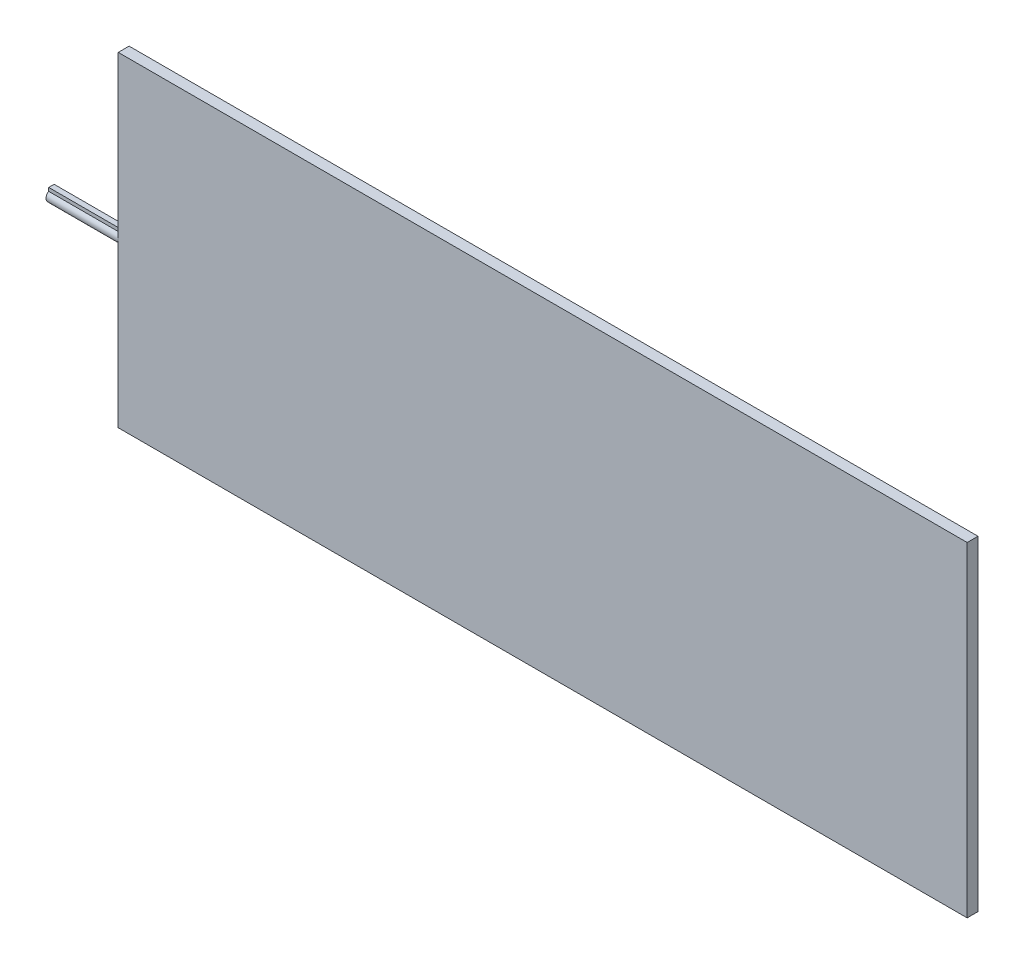
ISO-10303-21;
HEADER;
FILE_DESCRIPTION(('STEP AP214'),'2;1');
FILE_NAME('part.step','',(''),(''),'','','');
FILE_SCHEMA(('AUTOMOTIVE_DESIGN { 1 0 10303 214 1 1 1 1 }'));
ENDSEC;
DATA;
#1=APPLICATION_CONTEXT('core data for automotive mechanical design processes');
#2=APPLICATION_PROTOCOL_DEFINITION('international standard','automotive_design',2000,#1);
#3=PRODUCT_CONTEXT('',#1,'mechanical');
#4=PRODUCT('Part','Part','',(#3));
#5=PRODUCT_RELATED_PRODUCT_CATEGORY('part','',(#4));
#6=PRODUCT_DEFINITION_FORMATION('','',#4);
#7=PRODUCT_DEFINITION_CONTEXT('part definition',#1,'design');
#8=PRODUCT_DEFINITION('design','',#6,#7);
#9=PRODUCT_DEFINITION_SHAPE('','',#8);
#10=(LENGTH_UNIT() NAMED_UNIT(*) SI_UNIT(.MILLI.,.METRE.));
#11=(NAMED_UNIT(*) PLANE_ANGLE_UNIT() SI_UNIT($,.RADIAN.));
#12=(NAMED_UNIT(*) SI_UNIT($,.STERADIAN.) SOLID_ANGLE_UNIT());
#13=UNCERTAINTY_MEASURE_WITH_UNIT(LENGTH_MEASURE(1.E-05),#10,'distance_accuracy_value','');
#14=(GEOMETRIC_REPRESENTATION_CONTEXT(3) GLOBAL_UNCERTAINTY_ASSIGNED_CONTEXT((#13)) GLOBAL_UNIT_ASSIGNED_CONTEXT((#10,
#11,#12)) REPRESENTATION_CONTEXT('',''));
#15=CARTESIAN_POINT('',(0.,0.,0.));
#16=DIRECTION('',(0.,0.,1.));
#17=DIRECTION('',(1.,0.,0.));
#18=AXIS2_PLACEMENT_3D('',#15,#16,#17);
#19=CARTESIAN_POINT('',(-117.5,-45.,3.));
#20=DIRECTION('',(1.,0.,0.));
#21=DIRECTION('',(0.,0.,-1.));
#22=AXIS2_PLACEMENT_3D('',#19,#20,#21);
#23=PLANE('',#22);
#24=CARTESIAN_POINT('',(-117.5,0.,1.5));
#25=DIRECTION('',(-1.,0.,0.));
#26=DIRECTION('',(0.,0.,1.));
#27=AXIS2_PLACEMENT_3D('',#24,#25,#26);
#28=CIRCLE('',#27,1.5);
#29=CARTESIAN_POINT('',(-117.5,1.29903810567667,0.749999999999994));
#30=VERTEX_POINT('',#29);
#31=CARTESIAN_POINT('',(-117.5,0.,0.));
#32=VERTEX_POINT('',#31);
#33=EDGE_CURVE('E51',#30,#32,#28,.T.);
#34=ORIENTED_EDGE('',*,*,#33,.F.);
#35=DIRECTION('',(0.,-1.,0.));
#36=VECTOR('',#35,1.);
#37=CARTESIAN_POINT('',(-117.5,2.25000000000001,0.749999999999994));
#38=LINE('',#37,#36);
#39=CARTESIAN_POINT('',(-117.5,2.25000000000001,0.749999999999994));
#40=VERTEX_POINT('',#39);
#41=EDGE_CURVE('E61',#40,#30,#38,.T.);
#42=ORIENTED_EDGE('',*,*,#41,.F.);
#43=DIRECTION('',(0.,0.,-1.));
#44=VECTOR('',#43,1.);
#45=CARTESIAN_POINT('',(-117.5,2.25000000000001,0.749999999999994));
#46=LINE('',#45,#44);
#47=CARTESIAN_POINT('',(-117.5,2.25000000000001,2.24999999999999));
#48=VERTEX_POINT('',#47);
#49=EDGE_CURVE('E196',#48,#40,#46,.T.);
#50=ORIENTED_EDGE('',*,*,#49,.F.);
#51=DIRECTION('',(0.,1.,0.));
#52=VECTOR('',#51,1.);
#53=CARTESIAN_POINT('',(-117.5,2.25000000000001,2.24999999999999));
#54=LINE('',#53,#52);
#55=CARTESIAN_POINT('',(-117.5,1.29903810567667,2.24999999999999));
#56=VERTEX_POINT('',#55);
#57=EDGE_CURVE('E194',#56,#48,#54,.T.);
#58=ORIENTED_EDGE('',*,*,#57,.F.);
#59=CARTESIAN_POINT('',(-117.5,0.,3.));
#60=VERTEX_POINT('',#59);
#61=EDGE_CURVE('E49',#60,#56,#28,.T.);
#62=ORIENTED_EDGE('',*,*,#61,.F.);
#63=DIRECTION('',(0.,-1.,0.));
#64=VECTOR('',#63,1.);
#65=CARTESIAN_POINT('',(-117.5,-45.,3.));
#66=LINE('',#65,#64);
#67=CARTESIAN_POINT('',(-117.5,45.,3.));
#68=VERTEX_POINT('',#67);
#69=EDGE_CURVE('E158',#68,#60,#66,.T.);
#70=ORIENTED_EDGE('',*,*,#69,.F.);
#71=DIRECTION('',(0.,0.,-1.));
#72=VECTOR('',#71,1.);
#73=CARTESIAN_POINT('',(-117.5,45.,3.));
#74=LINE('',#73,#72);
#75=CARTESIAN_POINT('',(-117.5,45.,0.));
#76=VERTEX_POINT('',#75);
#77=EDGE_CURVE('E180',#68,#76,#74,.T.);
#78=ORIENTED_EDGE('',*,*,#77,.T.);
#79=DIRECTION('',(0.,-1.,0.));
#80=VECTOR('',#79,1.);
#81=CARTESIAN_POINT('',(-117.5,-45.,0.));
#82=LINE('',#81,#80);
#83=EDGE_CURVE('E169',#76,#32,#82,.T.);
#84=ORIENTED_EDGE('',*,*,#83,.T.);
#85=EDGE_LOOP('',(#34,#42,#50,#58,#62,#70,#78,#84));
#86=FACE_BOUND('',#85,.T.);
#87=ADVANCED_FACE('F39',(#86),#23,.F.);
#88=EDGE_CURVE('E11',#32,#60,#28,.T.);
#89=ORIENTED_EDGE('',*,*,#88,.F.);
#90=CARTESIAN_POINT('',(-117.5,-45.,0.));
#91=VERTEX_POINT('',#90);
#92=EDGE_CURVE('E168',#32,#91,#82,.T.);
#93=ORIENTED_EDGE('',*,*,#92,.T.);
#94=DIRECTION('',(0.,0.,-1.));
#95=VECTOR('',#94,1.);
#96=CARTESIAN_POINT('',(-117.5,-45.,3.));
#97=LINE('',#96,#95);
#98=CARTESIAN_POINT('',(-117.5,-45.,3.));
#99=VERTEX_POINT('',#98);
#100=EDGE_CURVE('E177',#99,#91,#97,.T.);
#101=ORIENTED_EDGE('',*,*,#100,.F.);
#102=EDGE_CURVE('E157',#60,#99,#66,.T.);
#103=ORIENTED_EDGE('',*,*,#102,.F.);
#104=EDGE_LOOP('',(#89,#93,#101,#103));
#105=FACE_BOUND('',#104,.T.);
#106=ADVANCED_FACE('F214',(#105),#23,.F.);
#107=CARTESIAN_POINT('',(117.5,-45.,3.));
#108=DIRECTION('',(-1.,0.,0.));
#109=DIRECTION('',(0.,0.,1.));
#110=AXIS2_PLACEMENT_3D('',#107,#108,#109);
#111=PLANE('',#110);
#112=DIRECTION('',(0.,1.,0.));
#113=VECTOR('',#112,1.);
#114=CARTESIAN_POINT('',(117.5,-45.,0.));
#115=LINE('',#114,#113);
#116=CARTESIAN_POINT('',(117.5,-45.,0.));
#117=VERTEX_POINT('',#116);
#118=CARTESIAN_POINT('',(117.5,45.,0.));
#119=VERTEX_POINT('',#118);
#120=EDGE_CURVE('E138',#117,#119,#115,.T.);
#121=ORIENTED_EDGE('',*,*,#120,.T.);
#122=DIRECTION('',(0.,0.,-1.));
#123=VECTOR('',#122,1.);
#124=CARTESIAN_POINT('',(117.5,45.,3.));
#125=LINE('',#124,#123);
#126=CARTESIAN_POINT('',(117.5,45.,3.));
#127=VERTEX_POINT('',#126);
#128=EDGE_CURVE('E43',#127,#119,#125,.T.);
#129=ORIENTED_EDGE('',*,*,#128,.F.);
#130=DIRECTION('',(0.,1.,0.));
#131=VECTOR('',#130,1.);
#132=CARTESIAN_POINT('',(117.5,-45.,3.));
#133=LINE('',#132,#131);
#134=CARTESIAN_POINT('',(117.5,-45.,3.));
#135=VERTEX_POINT('',#134);
#136=EDGE_CURVE('E149',#135,#127,#133,.T.);
#137=ORIENTED_EDGE('',*,*,#136,.F.);
#138=DIRECTION('',(0.,0.,-1.));
#139=VECTOR('',#138,1.);
#140=CARTESIAN_POINT('',(117.5,-45.,3.));
#141=LINE('',#140,#139);
#142=EDGE_CURVE('E164',#135,#117,#141,.T.);
#143=ORIENTED_EDGE('',*,*,#142,.T.);
#144=EDGE_LOOP('',(#121,#129,#137,#143));
#145=FACE_BOUND('',#144,.T.);
#146=ADVANCED_FACE('F41',(#145),#111,.F.);
#147=CARTESIAN_POINT('',(-117.5,45.,3.));
#148=DIRECTION('',(0.,-1.,0.));
#149=DIRECTION('',(0.,0.,-1.));
#150=AXIS2_PLACEMENT_3D('',#147,#148,#149);
#151=PLANE('',#150);
#152=DIRECTION('',(-1.,0.,0.));
#153=VECTOR('',#152,1.);
#154=CARTESIAN_POINT('',(-117.5,45.,0.));
#155=LINE('',#154,#153);
#156=EDGE_CURVE('E143',#119,#76,#155,.T.);
#157=ORIENTED_EDGE('',*,*,#156,.T.);
#158=ORIENTED_EDGE('',*,*,#77,.F.);
#159=DIRECTION('',(-1.,0.,0.));
#160=VECTOR('',#159,1.);
#161=CARTESIAN_POINT('',(-117.5,45.,3.));
#162=LINE('',#161,#160);
#163=EDGE_CURVE('E153',#127,#68,#162,.T.);
#164=ORIENTED_EDGE('',*,*,#163,.F.);
#165=ORIENTED_EDGE('',*,*,#128,.T.);
#166=EDGE_LOOP('',(#157,#158,#164,#165));
#167=FACE_BOUND('',#166,.T.);
#168=ADVANCED_FACE('F221',(#167),#151,.F.);
#169=CARTESIAN_POINT('',(-117.5,-45.,3.));
#170=DIRECTION('',(0.,1.,0.));
#171=DIRECTION('',(0.,0.,1.));
#172=AXIS2_PLACEMENT_3D('',#169,#170,#171);
#173=PLANE('',#172);
#174=DIRECTION('',(1.,0.,0.));
#175=VECTOR('',#174,1.);
#176=CARTESIAN_POINT('',(-117.5,-45.,0.));
#177=LINE('',#176,#175);
#178=EDGE_CURVE('E154',#91,#117,#177,.T.);
#179=ORIENTED_EDGE('',*,*,#178,.T.);
#180=ORIENTED_EDGE('',*,*,#142,.F.);
#181=DIRECTION('',(1.,0.,0.));
#182=VECTOR('',#181,1.);
#183=CARTESIAN_POINT('',(-117.5,-45.,3.));
#184=LINE('',#183,#182);
#185=EDGE_CURVE('E162',#99,#135,#184,.T.);
#186=ORIENTED_EDGE('',*,*,#185,.F.);
#187=ORIENTED_EDGE('',*,*,#100,.T.);
#188=EDGE_LOOP('',(#179,#180,#186,#187));
#189=FACE_BOUND('',#188,.T.);
#190=ADVANCED_FACE('F228',(#189),#173,.F.);
#191=CARTESIAN_POINT('',(0.,0.,3.));
#192=DIRECTION('',(0.,0.,-1.));
#193=DIRECTION('',(-1.,0.,0.));
#194=AXIS2_PLACEMENT_3D('',#191,#192,#193);
#195=PLANE('',#194);
#196=ORIENTED_EDGE('',*,*,#136,.T.);
#197=ORIENTED_EDGE('',*,*,#163,.T.);
#198=ORIENTED_EDGE('',*,*,#69,.T.);
#199=ORIENTED_EDGE('',*,*,#102,.T.);
#200=ORIENTED_EDGE('',*,*,#185,.T.);
#201=EDGE_LOOP('',(#196,#197,#198,#199,#200));
#202=FACE_BOUND('',#201,.T.);
#203=ADVANCED_FACE('F219',(#202),#195,.F.);
#204=CARTESIAN_POINT('',(0.,0.,0.));
#205=DIRECTION('',(0.,0.,-1.));
#206=DIRECTION('',(-1.,0.,0.));
#207=AXIS2_PLACEMENT_3D('',#204,#205,#206);
#208=PLANE('',#207);
#209=ORIENTED_EDGE('',*,*,#120,.F.);
#210=ORIENTED_EDGE('',*,*,#178,.F.);
#211=ORIENTED_EDGE('',*,*,#92,.F.);
#212=ORIENTED_EDGE('',*,*,#83,.F.);
#213=ORIENTED_EDGE('',*,*,#156,.F.);
#214=EDGE_LOOP('',(#209,#210,#211,#212,#213));
#215=FACE_BOUND('',#214,.T.);
#216=ADVANCED_FACE('F224',(#215),#208,.T.);
#217=CARTESIAN_POINT('',(-137.5,0.,1.5));
#218=DIRECTION('',(1.,0.,0.));
#219=DIRECTION('',(0.,0.,-1.));
#220=AXIS2_PLACEMENT_3D('',#217,#218,#219);
#221=CYLINDRICAL_SURFACE('',#220,1.5);
#222=ORIENTED_EDGE('',*,*,#33,.T.);
#223=ORIENTED_EDGE('',*,*,#88,.T.);
#224=ORIENTED_EDGE('',*,*,#61,.T.);
#225=DIRECTION('',(1.,0.,0.));
#226=VECTOR('',#225,1.);
#227=CARTESIAN_POINT('',(-137.5,1.29903810567667,2.24999999999999));
#228=LINE('',#227,#226);
#229=CARTESIAN_POINT('',(-137.5,1.29903810567667,2.24999999999999));
#230=VERTEX_POINT('',#229);
#231=EDGE_CURVE('E117',#230,#56,#228,.T.);
#232=ORIENTED_EDGE('',*,*,#231,.F.);
#233=CARTESIAN_POINT('',(-137.5,0.,1.5));
#234=DIRECTION('',(-1.,0.,0.));
#235=DIRECTION('',(0.,0.,1.));
#236=AXIS2_PLACEMENT_3D('',#233,#234,#235);
#237=CIRCLE('',#236,1.5);
#238=CARTESIAN_POINT('',(-137.5,1.29903810567667,0.749999999999994));
#239=VERTEX_POINT('',#238);
#240=EDGE_CURVE('E124',#239,#230,#237,.T.);
#241=ORIENTED_EDGE('',*,*,#240,.F.);
#242=DIRECTION('',(1.,0.,0.));
#243=VECTOR('',#242,1.);
#244=CARTESIAN_POINT('',(-137.5,1.29903810567667,0.749999999999994));
#245=LINE('',#244,#243);
#246=EDGE_CURVE('E202',#239,#30,#245,.T.);
#247=ORIENTED_EDGE('',*,*,#246,.T.);
#248=EDGE_LOOP('',(#222,#223,#224,#232,#241,#247));
#249=FACE_BOUND('',#248,.T.);
#250=ADVANCED_FACE('F136',(#249),#221,.T.);
#251=CARTESIAN_POINT('',(-137.5,2.25000000000001,2.24999999999999));
#252=DIRECTION('',(0.,0.,-1.));
#253=DIRECTION('',(0.,1.,0.));
#254=AXIS2_PLACEMENT_3D('',#251,#252,#253);
#255=PLANE('',#254);
#256=ORIENTED_EDGE('',*,*,#57,.T.);
#257=DIRECTION('',(1.,0.,0.));
#258=VECTOR('',#257,1.);
#259=CARTESIAN_POINT('',(-137.5,2.25000000000001,2.24999999999999));
#260=LINE('',#259,#258);
#261=CARTESIAN_POINT('',(-137.5,2.25000000000001,2.24999999999999));
#262=VERTEX_POINT('',#261);
#263=EDGE_CURVE('E119',#262,#48,#260,.T.);
#264=ORIENTED_EDGE('',*,*,#263,.F.);
#265=DIRECTION('',(0.,1.,0.));
#266=VECTOR('',#265,1.);
#267=CARTESIAN_POINT('',(-137.5,2.25000000000001,2.24999999999999));
#268=LINE('',#267,#266);
#269=EDGE_CURVE('E112',#230,#262,#268,.T.);
#270=ORIENTED_EDGE('',*,*,#269,.F.);
#271=ORIENTED_EDGE('',*,*,#231,.T.);
#272=EDGE_LOOP('',(#256,#264,#270,#271));
#273=FACE_BOUND('',#272,.T.);
#274=ADVANCED_FACE('F115',(#273),#255,.F.);
#275=CARTESIAN_POINT('',(-137.5,2.25000000000001,0.749999999999994));
#276=DIRECTION('',(0.,-1.,0.));
#277=DIRECTION('',(0.,0.,-1.));
#278=AXIS2_PLACEMENT_3D('',#275,#276,#277);
#279=PLANE('',#278);
#280=ORIENTED_EDGE('',*,*,#49,.T.);
#281=DIRECTION('',(1.,0.,0.));
#282=VECTOR('',#281,1.);
#283=CARTESIAN_POINT('',(-137.5,2.25000000000001,0.749999999999994));
#284=LINE('',#283,#282);
#285=CARTESIAN_POINT('',(-137.5,2.25000000000001,0.749999999999994));
#286=VERTEX_POINT('',#285);
#287=EDGE_CURVE('E145',#286,#40,#284,.T.);
#288=ORIENTED_EDGE('',*,*,#287,.F.);
#289=DIRECTION('',(0.,0.,-1.));
#290=VECTOR('',#289,1.);
#291=CARTESIAN_POINT('',(-137.5,2.25000000000001,0.749999999999994));
#292=LINE('',#291,#290);
#293=EDGE_CURVE('E123',#262,#286,#292,.T.);
#294=ORIENTED_EDGE('',*,*,#293,.F.);
#295=ORIENTED_EDGE('',*,*,#263,.T.);
#296=EDGE_LOOP('',(#280,#288,#294,#295));
#297=FACE_BOUND('',#296,.T.);
#298=ADVANCED_FACE('F210',(#297),#279,.F.);
#299=CARTESIAN_POINT('',(-137.5,2.25000000000001,0.749999999999994));
#300=DIRECTION('',(0.,0.,1.));
#301=DIRECTION('',(0.,-1.,0.));
#302=AXIS2_PLACEMENT_3D('',#299,#300,#301);
#303=PLANE('',#302);
#304=ORIENTED_EDGE('',*,*,#41,.T.);
#305=ORIENTED_EDGE('',*,*,#246,.F.);
#306=DIRECTION('',(0.,-1.,0.));
#307=VECTOR('',#306,1.);
#308=CARTESIAN_POINT('',(-137.5,2.25000000000001,0.749999999999994));
#309=LINE('',#308,#307);
#310=EDGE_CURVE('E129',#286,#239,#309,.T.);
#311=ORIENTED_EDGE('',*,*,#310,.F.);
#312=ORIENTED_EDGE('',*,*,#287,.T.);
#313=EDGE_LOOP('',(#304,#305,#311,#312));
#314=FACE_BOUND('',#313,.T.);
#315=ADVANCED_FACE('F208',(#314),#303,.F.);
#316=CARTESIAN_POINT('',(-137.5,0.,1.5));
#317=DIRECTION('',(-1.,0.,0.));
#318=DIRECTION('',(0.,0.,1.));
#319=AXIS2_PLACEMENT_3D('',#316,#317,#318);
#320=PLANE('',#319);
#321=ORIENTED_EDGE('',*,*,#240,.T.);
#322=ORIENTED_EDGE('',*,*,#269,.T.);
#323=ORIENTED_EDGE('',*,*,#293,.T.);
#324=ORIENTED_EDGE('',*,*,#310,.T.);
#325=EDGE_LOOP('',(#321,#322,#323,#324));
#326=FACE_BOUND('',#325,.T.);
#327=ADVANCED_FACE('F127',(#326),#320,.T.);
#328=CLOSED_SHELL('',(#87,#106,#146,#168,#190,#203,#216,#250,#274,#298,#315,#327));
#329=MANIFOLD_SOLID_BREP('B2',#328);
#330=ADVANCED_BREP_SHAPE_REPRESENTATION('',(#18,#329),#14);
#331=SHAPE_DEFINITION_REPRESENTATION(#9,#330);
ENDSEC;
END-ISO-10303-21;
